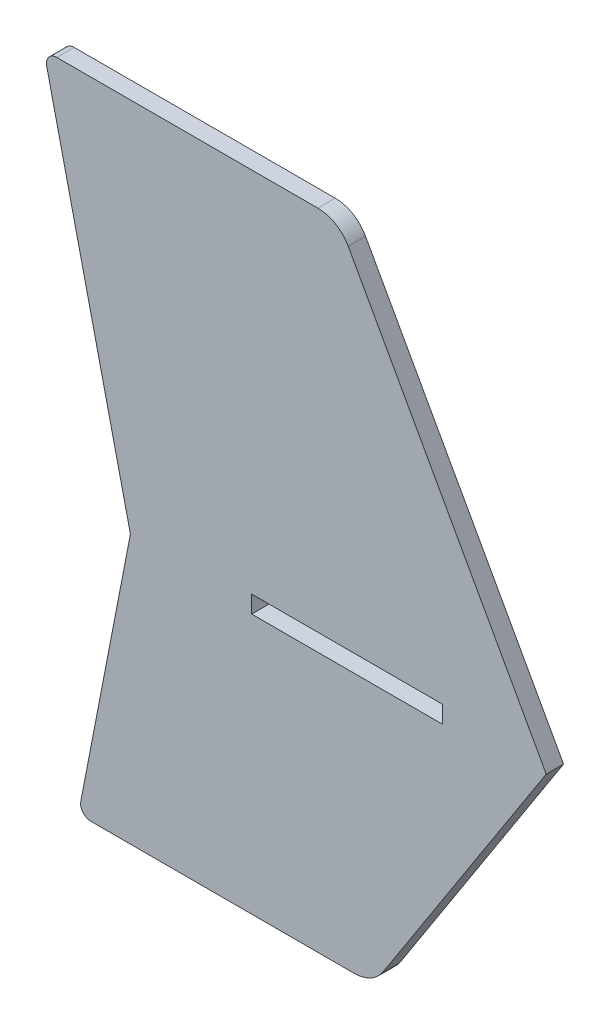
ISO-10303-21;
HEADER;
FILE_DESCRIPTION(('STEP AP214'),'2;1');
FILE_NAME('part.step','',(''),(''),'','','');
FILE_SCHEMA(('AUTOMOTIVE_DESIGN { 1 0 10303 214 1 1 1 1 }'));
ENDSEC;
DATA;
#1=APPLICATION_CONTEXT('core data for automotive mechanical design processes');
#2=APPLICATION_PROTOCOL_DEFINITION('international standard','automotive_design',2000,#1);
#3=PRODUCT_CONTEXT('',#1,'mechanical');
#4=PRODUCT('Part','Part','',(#3));
#5=PRODUCT_RELATED_PRODUCT_CATEGORY('part','',(#4));
#6=PRODUCT_DEFINITION_FORMATION('','',#4);
#7=PRODUCT_DEFINITION_CONTEXT('part definition',#1,'design');
#8=PRODUCT_DEFINITION('design','',#6,#7);
#9=PRODUCT_DEFINITION_SHAPE('','',#8);
#10=(LENGTH_UNIT() NAMED_UNIT(*) SI_UNIT(.MILLI.,.METRE.));
#11=(NAMED_UNIT(*) PLANE_ANGLE_UNIT() SI_UNIT($,.RADIAN.));
#12=(NAMED_UNIT(*) SI_UNIT($,.STERADIAN.) SOLID_ANGLE_UNIT());
#13=UNCERTAINTY_MEASURE_WITH_UNIT(LENGTH_MEASURE(1.E-05),#10,'distance_accuracy_value','');
#14=(GEOMETRIC_REPRESENTATION_CONTEXT(3) GLOBAL_UNCERTAINTY_ASSIGNED_CONTEXT((#13)) GLOBAL_UNIT_ASSIGNED_CONTEXT((#10,
#11,#12)) REPRESENTATION_CONTEXT('',''));
#15=CARTESIAN_POINT('',(0.,0.,0.));
#16=DIRECTION('',(0.,0.,1.));
#17=DIRECTION('',(1.,0.,0.));
#18=AXIS2_PLACEMENT_3D('',#15,#16,#17);
#19=CARTESIAN_POINT('',(-50.,186.,5.));
#20=DIRECTION('',(0.974466825284074,0.224531526563151,0.));
#21=DIRECTION('',(-0.224531526563151,0.974466825284074,0.));
#22=AXIS2_PLACEMENT_3D('',#19,#20,#21);
#23=PLANE('',#22);
#24=DIRECTION('',(0.224531526563151,-0.974466825284073,0.));
#25=VECTOR('',#24,1.);
#26=CARTESIAN_POINT('',(-50.,186.,5.));
#27=LINE('',#26,#25);
#28=CARTESIAN_POINT('',(-49.1535496360163,182.32640542031,5.));
#29=VERTEX_POINT('',#28);
#30=CARTESIAN_POINT('',(-25.,77.5,5.));
#31=VERTEX_POINT('',#30);
#32=EDGE_CURVE('E168',#29,#31,#27,.T.);
#33=ORIENTED_EDGE('',*,*,#32,.F.);
#34=DIRECTION('',(0.,0.,-1.));
#35=VECTOR('',#34,1.);
#36=CARTESIAN_POINT('',(-49.1535496360163,182.32640542031,0.));
#37=LINE('',#36,#35);
#38=CARTESIAN_POINT('',(-49.1535496360163,182.32640542031,0.));
#39=VERTEX_POINT('',#38);
#40=EDGE_CURVE('E41',#29,#39,#37,.T.);
#41=ORIENTED_EDGE('',*,*,#40,.T.);
#42=DIRECTION('',(0.224531526563151,-0.974466825284073,0.));
#43=VECTOR('',#42,1.);
#44=CARTESIAN_POINT('',(-50.,186.,0.));
#45=LINE('',#44,#43);
#46=CARTESIAN_POINT('',(-25.,77.5,0.));
#47=VERTEX_POINT('',#46);
#48=EDGE_CURVE('E165',#39,#47,#45,.T.);
#49=ORIENTED_EDGE('',*,*,#48,.T.);
#50=DIRECTION('',(0.,0.,-1.));
#51=VECTOR('',#50,1.);
#52=CARTESIAN_POINT('',(-25.,77.5,5.));
#53=LINE('',#52,#51);
#54=EDGE_CURVE('E199',#31,#47,#53,.T.);
#55=ORIENTED_EDGE('',*,*,#54,.F.);
#56=EDGE_LOOP('',(#33,#41,#49,#55));
#57=FACE_BOUND('',#56,.T.);
#58=ADVANCED_FACE('F33',(#57),#23,.F.);
#59=CARTESIAN_POINT('',(-25.,77.5,5.));
#60=DIRECTION('',(0.981779850590281,-0.190021906565861,0.));
#61=DIRECTION('',(0.190021906565861,0.981779850590281,0.));
#62=AXIS2_PLACEMENT_3D('',#59,#60,#61);
#63=PLANE('',#62);
#64=DIRECTION('',(-0.190021906565861,-0.981779850590281,0.));
#65=VECTOR('',#64,1.);
#66=CARTESIAN_POINT('',(-25.,77.5,0.));
#67=LINE('',#66,#65);
#68=CARTESIAN_POINT('',(-39.309019538123,3.5700657196976,0.));
#69=VERTEX_POINT('',#68);
#70=EDGE_CURVE('E185',#47,#69,#67,.T.);
#71=ORIENTED_EDGE('',*,*,#70,.T.);
#72=DIRECTION('',(0.,0.,-1.));
#73=VECTOR('',#72,1.);
#74=CARTESIAN_POINT('',(-39.309019538123,3.57006571969758,5.));
#75=LINE('',#74,#73);
#76=CARTESIAN_POINT('',(-39.309019538123,3.5700657196976,5.));
#77=VERTEX_POINT('',#76);
#78=EDGE_CURVE('E238',#69,#77,#75,.F.);
#79=ORIENTED_EDGE('',*,*,#78,.T.);
#80=DIRECTION('',(-0.190021906565861,-0.981779850590281,0.));
#81=VECTOR('',#80,1.);
#82=CARTESIAN_POINT('',(-25.,77.5,5.));
#83=LINE('',#82,#81);
#84=EDGE_CURVE('E170',#31,#77,#83,.T.);
#85=ORIENTED_EDGE('',*,*,#84,.F.);
#86=ORIENTED_EDGE('',*,*,#54,.T.);
#87=EDGE_LOOP('',(#71,#79,#85,#86));
#88=FACE_BOUND('',#87,.T.);
#89=ADVANCED_FACE('F254',(#88),#63,.F.);
#90=CARTESIAN_POINT('',(45.,0.,5.));
#91=DIRECTION('',(0.,-1.,0.));
#92=DIRECTION('',(1.,0.,0.));
#93=AXIS2_PLACEMENT_3D('',#90,#91,#92);
#94=PLANE('',#93);
#95=DIRECTION('',(1.,0.,0.));
#96=VECTOR('',#95,1.);
#97=CARTESIAN_POINT('',(-40.,0.,5.));
#98=LINE('',#97,#96);
#99=CARTESIAN_POINT('',(-36.3636799863522,0.,5.));
#100=VERTEX_POINT('',#99);
#101=CARTESIAN_POINT('',(39.5510537124537,0.,5.));
#102=VERTEX_POINT('',#101);
#103=EDGE_CURVE('E174',#100,#102,#98,.T.);
#104=ORIENTED_EDGE('',*,*,#103,.F.);
#105=DIRECTION('',(0.,0.,-1.));
#106=VECTOR('',#105,1.);
#107=CARTESIAN_POINT('',(-36.3636799863522,0.,0.));
#108=LINE('',#107,#106);
#109=CARTESIAN_POINT('',(-36.3636799863522,0.,0.));
#110=VERTEX_POINT('',#109);
#111=EDGE_CURVE('E231',#100,#110,#108,.T.);
#112=ORIENTED_EDGE('',*,*,#111,.T.);
#113=DIRECTION('',(-1.,0.,0.));
#114=VECTOR('',#113,1.);
#115=CARTESIAN_POINT('',(45.,0.,0.));
#116=LINE('',#115,#114);
#117=CARTESIAN_POINT('',(39.5510537124537,0.,0.));
#118=VERTEX_POINT('',#117);
#119=EDGE_CURVE('E188',#118,#110,#116,.T.);
#120=ORIENTED_EDGE('',*,*,#119,.F.);
#121=DIRECTION('',(0.,0.,-1.));
#122=VECTOR('',#121,1.);
#123=CARTESIAN_POINT('',(39.5510537124537,0.,5.));
#124=LINE('',#123,#122);
#125=EDGE_CURVE('E218',#118,#102,#124,.F.);
#126=ORIENTED_EDGE('',*,*,#125,.T.);
#127=EDGE_LOOP('',(#104,#112,#120,#126));
#128=FACE_BOUND('',#127,.T.);
#129=ADVANCED_FACE('F262',(#128),#94,.T.);
#130=CARTESIAN_POINT('',(95.,77.5,5.));
#131=DIRECTION('',(0.840296648224244,-0.542126869822093,0.));
#132=DIRECTION('',(0.542126869822093,0.840296648224244,0.));
#133=AXIS2_PLACEMENT_3D('',#130,#131,#132);
#134=PLANE('',#133);
#135=DIRECTION('',(-0.542126869822093,-0.840296648224244,0.));
#136=VECTOR('',#135,1.);
#137=CARTESIAN_POINT('',(95.,77.5,5.));
#138=LINE('',#137,#136);
#139=CARTESIAN_POINT('',(95.,77.5,5.));
#140=VERTEX_POINT('',#139);
#141=CARTESIAN_POINT('',(47.9540201946962,4.57873130177908,5.));
#142=VERTEX_POINT('',#141);
#143=EDGE_CURVE('E176',#140,#142,#138,.T.);
#144=ORIENTED_EDGE('',*,*,#143,.T.);
#145=DIRECTION('',(0.,0.,-1.));
#146=VECTOR('',#145,1.);
#147=CARTESIAN_POINT('',(47.9540201946962,4.57873130177906,5.));
#148=LINE('',#147,#146);
#149=CARTESIAN_POINT('',(47.9540201946962,4.57873130177908,0.));
#150=VERTEX_POINT('',#149);
#151=EDGE_CURVE('E211',#142,#150,#148,.T.);
#152=ORIENTED_EDGE('',*,*,#151,.T.);
#153=DIRECTION('',(-0.542126869822093,-0.840296648224244,0.));
#154=VECTOR('',#153,1.);
#155=CARTESIAN_POINT('',(95.,77.5,0.));
#156=LINE('',#155,#154);
#157=CARTESIAN_POINT('',(95.,77.5,0.));
#158=VERTEX_POINT('',#157);
#159=EDGE_CURVE('E191',#158,#150,#156,.T.);
#160=ORIENTED_EDGE('',*,*,#159,.F.);
#161=DIRECTION('',(0.,0.,-1.));
#162=VECTOR('',#161,1.);
#163=CARTESIAN_POINT('',(95.,77.5,5.));
#164=LINE('',#163,#162);
#165=EDGE_CURVE('E183',#140,#158,#164,.T.);
#166=ORIENTED_EDGE('',*,*,#165,.F.);
#167=EDGE_LOOP('',(#144,#152,#160,#166));
#168=FACE_BOUND('',#167,.T.);
#169=ADVANCED_FACE('F270',(#168),#134,.T.);
#170=CARTESIAN_POINT('',(35.,186.,5.));
#171=DIRECTION('',(0.875106719898271,0.483929983353883,0.));
#172=DIRECTION('',(-0.483929983353883,0.875106719898271,0.));
#173=AXIS2_PLACEMENT_3D('',#170,#171,#172);
#174=PLANE('',#173);
#175=DIRECTION('',(0.483929983353883,-0.875106719898271,0.));
#176=VECTOR('',#175,1.);
#177=CARTESIAN_POINT('',(35.,186.,0.));
#178=LINE('',#177,#176);
#179=CARTESIAN_POINT('',(37.8538434100246,180.839299833539,0.));
#180=VERTEX_POINT('',#179);
#181=EDGE_CURVE('E194',#180,#158,#178,.T.);
#182=ORIENTED_EDGE('',*,*,#181,.F.);
#183=DIRECTION('',(0.,0.,-1.));
#184=VECTOR('',#183,1.);
#185=CARTESIAN_POINT('',(37.8538434100246,180.839299833539,5.));
#186=LINE('',#185,#184);
#187=CARTESIAN_POINT('',(37.8538434100246,180.839299833539,5.));
#188=VERTEX_POINT('',#187);
#189=EDGE_CURVE('E229',#180,#188,#186,.F.);
#190=ORIENTED_EDGE('',*,*,#189,.T.);
#191=DIRECTION('',(0.483929983353883,-0.875106719898271,0.));
#192=VECTOR('',#191,1.);
#193=CARTESIAN_POINT('',(35.,186.,5.));
#194=LINE('',#193,#192);
#195=EDGE_CURVE('E179',#188,#140,#194,.T.);
#196=ORIENTED_EDGE('',*,*,#195,.T.);
#197=ORIENTED_EDGE('',*,*,#165,.T.);
#198=EDGE_LOOP('',(#182,#190,#196,#197));
#199=FACE_BOUND('',#198,.T.);
#200=ADVANCED_FACE('F339',(#199),#174,.T.);
#201=CARTESIAN_POINT('',(-50.,186.,5.));
#202=DIRECTION('',(0.,1.,0.));
#203=DIRECTION('',(-1.,0.,0.));
#204=AXIS2_PLACEMENT_3D('',#201,#202,#203);
#205=PLANE('',#204);
#206=DIRECTION('',(1.,0.,0.));
#207=VECTOR('',#206,1.);
#208=CARTESIAN_POINT('',(-50.,186.,0.));
#209=LINE('',#208,#207);
#210=CARTESIAN_POINT('',(-46.230149160164,186.,0.));
#211=VERTEX_POINT('',#210);
#212=CARTESIAN_POINT('',(29.1027762110419,186.,0.));
#213=VERTEX_POINT('',#212);
#214=EDGE_CURVE('E171',#211,#213,#209,.T.);
#215=ORIENTED_EDGE('',*,*,#214,.F.);
#216=DIRECTION('',(0.,0.,-1.));
#217=VECTOR('',#216,1.);
#218=CARTESIAN_POINT('',(-46.230149160164,186.,5.));
#219=LINE('',#218,#217);
#220=CARTESIAN_POINT('',(-46.230149160164,186.,5.));
#221=VERTEX_POINT('',#220);
#222=EDGE_CURVE('E11',#211,#221,#219,.F.);
#223=ORIENTED_EDGE('',*,*,#222,.T.);
#224=DIRECTION('',(1.,0.,0.));
#225=VECTOR('',#224,1.);
#226=CARTESIAN_POINT('',(-50.,186.,5.));
#227=LINE('',#226,#225);
#228=CARTESIAN_POINT('',(29.1027762110419,186.,5.));
#229=VERTEX_POINT('',#228);
#230=EDGE_CURVE('E181',#221,#229,#227,.T.);
#231=ORIENTED_EDGE('',*,*,#230,.T.);
#232=DIRECTION('',(0.,0.,-1.));
#233=VECTOR('',#232,1.);
#234=CARTESIAN_POINT('',(29.1027762110419,186.,5.));
#235=LINE('',#234,#233);
#236=EDGE_CURVE('E226',#229,#213,#235,.T.);
#237=ORIENTED_EDGE('',*,*,#236,.T.);
#238=EDGE_LOOP('',(#215,#223,#231,#237));
#239=FACE_BOUND('',#238,.T.);
#240=ADVANCED_FACE('F281',(#239),#205,.T.);
#241=CARTESIAN_POINT('',(0.,0.,5.));
#242=DIRECTION('',(0.,0.,1.));
#243=DIRECTION('',(1.,0.,0.));
#244=AXIS2_PLACEMENT_3D('',#241,#242,#243);
#245=PLANE('',#244);
#246=DIRECTION('',(0.,-1.,0.));
#247=VECTOR('',#246,1.);
#248=CARTESIAN_POINT('',(10.,75.,5.));
#249=LINE('',#248,#247);
#250=CARTESIAN_POINT('',(10.,80.,5.));
#251=VERTEX_POINT('',#250);
#252=CARTESIAN_POINT('',(10.,75.,5.));
#253=VERTEX_POINT('',#252);
#254=EDGE_CURVE('E154',#251,#253,#249,.T.);
#255=ORIENTED_EDGE('',*,*,#254,.F.);
#256=DIRECTION('',(-1.,0.,0.));
#257=VECTOR('',#256,1.);
#258=CARTESIAN_POINT('',(10.,80.,5.));
#259=LINE('',#258,#257);
#260=CARTESIAN_POINT('',(65.,80.,5.));
#261=VERTEX_POINT('',#260);
#262=EDGE_CURVE('E158',#261,#251,#259,.T.);
#263=ORIENTED_EDGE('',*,*,#262,.F.);
#264=DIRECTION('',(0.,1.,0.));
#265=VECTOR('',#264,1.);
#266=CARTESIAN_POINT('',(65.,75.,5.));
#267=LINE('',#266,#265);
#268=CARTESIAN_POINT('',(65.,75.,5.));
#269=VERTEX_POINT('',#268);
#270=EDGE_CURVE('E138',#269,#261,#267,.T.);
#271=ORIENTED_EDGE('',*,*,#270,.F.);
#272=DIRECTION('',(1.,0.,0.));
#273=VECTOR('',#272,1.);
#274=CARTESIAN_POINT('',(10.,75.,5.));
#275=LINE('',#274,#273);
#276=EDGE_CURVE('E149',#253,#269,#275,.T.);
#277=ORIENTED_EDGE('',*,*,#276,.F.);
#278=EDGE_LOOP('',(#255,#263,#271,#277));
#279=FACE_BOUND('',#278,.T.);
#280=ORIENTED_EDGE('',*,*,#84,.T.);
#281=CARTESIAN_POINT('',(-36.3636799863522,3.,5.));
#282=DIRECTION('',(0.,0.,1.));
#283=DIRECTION('',(1.,0.,0.));
#284=AXIS2_PLACEMENT_3D('',#281,#282,#283);
#285=CIRCLE('',#284,3.);
#286=EDGE_CURVE('E241',#77,#100,#285,.T.);
#287=ORIENTED_EDGE('',*,*,#286,.T.);
#288=ORIENTED_EDGE('',*,*,#103,.T.);
#289=CARTESIAN_POINT('',(39.5510537124537,9.99999999999999,5.));
#290=DIRECTION('',(0.,0.,1.));
#291=DIRECTION('',(1.,0.,0.));
#292=AXIS2_PLACEMENT_3D('',#289,#290,#291);
#293=CIRCLE('',#292,10.);
#294=EDGE_CURVE('E224',#102,#142,#293,.T.);
#295=ORIENTED_EDGE('',*,*,#294,.T.);
#296=ORIENTED_EDGE('',*,*,#143,.F.);
#297=ORIENTED_EDGE('',*,*,#195,.F.);
#298=CARTESIAN_POINT('',(29.1027762110419,176.,5.));
#299=DIRECTION('',(0.,0.,1.));
#300=DIRECTION('',(1.,0.,0.));
#301=AXIS2_PLACEMENT_3D('',#298,#299,#300);
#302=CIRCLE('',#301,10.);
#303=EDGE_CURVE('E221',#188,#229,#302,.T.);
#304=ORIENTED_EDGE('',*,*,#303,.T.);
#305=ORIENTED_EDGE('',*,*,#230,.F.);
#306=CARTESIAN_POINT('',(-46.230149160164,183.,5.));
#307=DIRECTION('',(0.,0.,1.));
#308=DIRECTION('',(1.,0.,0.));
#309=AXIS2_PLACEMENT_3D('',#306,#307,#308);
#310=CIRCLE('',#309,3.);
#311=EDGE_CURVE('E48',#221,#29,#310,.T.);
#312=ORIENTED_EDGE('',*,*,#311,.T.);
#313=ORIENTED_EDGE('',*,*,#32,.T.);
#314=EDGE_LOOP('',(#280,#287,#288,#295,#296,#297,#304,#305,#312,#313));
#315=FACE_BOUND('',#314,.T.);
#316=ADVANCED_FACE('F156',(#279,#315),#245,.T.);
#317=CARTESIAN_POINT('',(0.,0.,0.));
#318=DIRECTION('',(0.,0.,1.));
#319=DIRECTION('',(1.,0.,0.));
#320=AXIS2_PLACEMENT_3D('',#317,#318,#319);
#321=PLANE('',#320);
#322=DIRECTION('',(-1.,0.,0.));
#323=VECTOR('',#322,1.);
#324=CARTESIAN_POINT('',(0.,80.,0.));
#325=LINE('',#324,#323);
#326=CARTESIAN_POINT('',(65.,80.,0.));
#327=VERTEX_POINT('',#326);
#328=CARTESIAN_POINT('',(10.,80.,0.));
#329=VERTEX_POINT('',#328);
#330=EDGE_CURVE('E205',#327,#329,#325,.T.);
#331=ORIENTED_EDGE('',*,*,#330,.T.);
#332=DIRECTION('',(0.,-1.,0.));
#333=VECTOR('',#332,1.);
#334=CARTESIAN_POINT('',(10.,0.,0.));
#335=LINE('',#334,#333);
#336=CARTESIAN_POINT('',(10.,75.,0.));
#337=VERTEX_POINT('',#336);
#338=EDGE_CURVE('E208',#329,#337,#335,.T.);
#339=ORIENTED_EDGE('',*,*,#338,.T.);
#340=DIRECTION('',(1.,0.,0.));
#341=VECTOR('',#340,1.);
#342=CARTESIAN_POINT('',(0.,75.,0.));
#343=LINE('',#342,#341);
#344=CARTESIAN_POINT('',(65.,75.,0.));
#345=VERTEX_POINT('',#344);
#346=EDGE_CURVE('E202',#337,#345,#343,.T.);
#347=ORIENTED_EDGE('',*,*,#346,.T.);
#348=DIRECTION('',(0.,1.,0.));
#349=VECTOR('',#348,1.);
#350=CARTESIAN_POINT('',(65.,0.,0.));
#351=LINE('',#350,#349);
#352=EDGE_CURVE('E141',#345,#327,#351,.T.);
#353=ORIENTED_EDGE('',*,*,#352,.T.);
#354=EDGE_LOOP('',(#331,#339,#347,#353));
#355=FACE_BOUND('',#354,.T.);
#356=ORIENTED_EDGE('',*,*,#119,.T.);
#357=CARTESIAN_POINT('',(-36.3636799863522,3.,0.));
#358=DIRECTION('',(0.,0.,1.));
#359=DIRECTION('',(1.,0.,0.));
#360=AXIS2_PLACEMENT_3D('',#357,#358,#359);
#361=CIRCLE('',#360,3.);
#362=EDGE_CURVE('E236',#110,#69,#361,.F.);
#363=ORIENTED_EDGE('',*,*,#362,.T.);
#364=ORIENTED_EDGE('',*,*,#70,.F.);
#365=ORIENTED_EDGE('',*,*,#48,.F.);
#366=CARTESIAN_POINT('',(-46.230149160164,183.,0.));
#367=DIRECTION('',(0.,0.,1.));
#368=DIRECTION('',(1.,0.,0.));
#369=AXIS2_PLACEMENT_3D('',#366,#367,#368);
#370=CIRCLE('',#369,3.);
#371=EDGE_CURVE('E234',#39,#211,#370,.F.);
#372=ORIENTED_EDGE('',*,*,#371,.T.);
#373=ORIENTED_EDGE('',*,*,#214,.T.);
#374=CARTESIAN_POINT('',(29.1027762110419,176.,0.));
#375=DIRECTION('',(0.,0.,1.));
#376=DIRECTION('',(1.,0.,0.));
#377=AXIS2_PLACEMENT_3D('',#374,#375,#376);
#378=CIRCLE('',#377,10.);
#379=EDGE_CURVE('E214',#213,#180,#378,.F.);
#380=ORIENTED_EDGE('',*,*,#379,.T.);
#381=ORIENTED_EDGE('',*,*,#181,.T.);
#382=ORIENTED_EDGE('',*,*,#159,.T.);
#383=CARTESIAN_POINT('',(39.5510537124537,9.99999999999999,0.));
#384=DIRECTION('',(0.,0.,1.));
#385=DIRECTION('',(1.,0.,0.));
#386=AXIS2_PLACEMENT_3D('',#383,#384,#385);
#387=CIRCLE('',#386,10.);
#388=EDGE_CURVE('E216',#150,#118,#387,.F.);
#389=ORIENTED_EDGE('',*,*,#388,.T.);
#390=EDGE_LOOP('',(#356,#363,#364,#365,#372,#373,#380,#381,#382,#389));
#391=FACE_BOUND('',#390,.T.);
#392=ADVANCED_FACE('F250',(#355,#391),#321,.F.);
#393=CARTESIAN_POINT('',(10.,75.,-10.));
#394=DIRECTION('',(-1.,0.,0.));
#395=DIRECTION('',(0.,0.,1.));
#396=AXIS2_PLACEMENT_3D('',#393,#394,#395);
#397=PLANE('',#396);
#398=DIRECTION('',(0.,0.,1.));
#399=VECTOR('',#398,1.);
#400=CARTESIAN_POINT('',(10.,80.,-10.));
#401=LINE('',#400,#399);
#402=EDGE_CURVE('E163',#329,#251,#401,.T.);
#403=ORIENTED_EDGE('',*,*,#402,.T.);
#404=ORIENTED_EDGE('',*,*,#254,.T.);
#405=DIRECTION('',(0.,0.,1.));
#406=VECTOR('',#405,1.);
#407=CARTESIAN_POINT('',(10.,75.,-10.));
#408=LINE('',#407,#406);
#409=EDGE_CURVE('E145',#337,#253,#408,.T.);
#410=ORIENTED_EDGE('',*,*,#409,.F.);
#411=ORIENTED_EDGE('',*,*,#338,.F.);
#412=EDGE_LOOP('',(#403,#404,#410,#411));
#413=FACE_BOUND('',#412,.T.);
#414=ADVANCED_FACE('F319',(#413),#397,.F.);
#415=CARTESIAN_POINT('',(10.,80.,-10.));
#416=DIRECTION('',(0.,1.,0.));
#417=DIRECTION('',(0.,0.,1.));
#418=AXIS2_PLACEMENT_3D('',#415,#416,#417);
#419=PLANE('',#418);
#420=DIRECTION('',(0.,0.,1.));
#421=VECTOR('',#420,1.);
#422=CARTESIAN_POINT('',(65.,80.,-10.));
#423=LINE('',#422,#421);
#424=EDGE_CURVE('E144',#327,#261,#423,.T.);
#425=ORIENTED_EDGE('',*,*,#424,.T.);
#426=ORIENTED_EDGE('',*,*,#262,.T.);
#427=ORIENTED_EDGE('',*,*,#402,.F.);
#428=ORIENTED_EDGE('',*,*,#330,.F.);
#429=EDGE_LOOP('',(#425,#426,#427,#428));
#430=FACE_BOUND('',#429,.T.);
#431=ADVANCED_FACE('F395',(#430),#419,.F.);
#432=CARTESIAN_POINT('',(65.,75.,-10.));
#433=DIRECTION('',(1.,0.,0.));
#434=DIRECTION('',(0.,0.,-1.));
#435=AXIS2_PLACEMENT_3D('',#432,#433,#434);
#436=PLANE('',#435);
#437=DIRECTION('',(0.,0.,1.));
#438=VECTOR('',#437,1.);
#439=CARTESIAN_POINT('',(65.,75.,-10.));
#440=LINE('',#439,#438);
#441=EDGE_CURVE('E133',#345,#269,#440,.T.);
#442=ORIENTED_EDGE('',*,*,#441,.T.);
#443=ORIENTED_EDGE('',*,*,#270,.T.);
#444=ORIENTED_EDGE('',*,*,#424,.F.);
#445=ORIENTED_EDGE('',*,*,#352,.F.);
#446=EDGE_LOOP('',(#442,#443,#444,#445));
#447=FACE_BOUND('',#446,.T.);
#448=ADVANCED_FACE('F135',(#447),#436,.F.);
#449=CARTESIAN_POINT('',(10.,75.,-10.));
#450=DIRECTION('',(0.,-1.,0.));
#451=DIRECTION('',(0.,0.,-1.));
#452=AXIS2_PLACEMENT_3D('',#449,#450,#451);
#453=PLANE('',#452);
#454=ORIENTED_EDGE('',*,*,#409,.T.);
#455=ORIENTED_EDGE('',*,*,#276,.T.);
#456=ORIENTED_EDGE('',*,*,#441,.F.);
#457=ORIENTED_EDGE('',*,*,#346,.F.);
#458=EDGE_LOOP('',(#454,#455,#456,#457));
#459=FACE_BOUND('',#458,.T.);
#460=ADVANCED_FACE('F150',(#459),#453,.F.);
#461=CARTESIAN_POINT('',(39.5510537124537,9.99999999999999,5.));
#462=DIRECTION('',(0.,0.,-1.));
#463=DIRECTION('',(-1.,0.,0.));
#464=AXIS2_PLACEMENT_3D('',#461,#462,#463);
#465=CYLINDRICAL_SURFACE('',#464,10.);
#466=ORIENTED_EDGE('',*,*,#294,.F.);
#467=ORIENTED_EDGE('',*,*,#125,.F.);
#468=ORIENTED_EDGE('',*,*,#388,.F.);
#469=ORIENTED_EDGE('',*,*,#151,.F.);
#470=EDGE_LOOP('',(#466,#467,#468,#469));
#471=FACE_BOUND('',#470,.T.);
#472=ADVANCED_FACE('F268',(#471),#465,.T.);
#473=CARTESIAN_POINT('',(29.1027762110419,176.,5.));
#474=DIRECTION('',(0.,0.,-1.));
#475=DIRECTION('',(-1.,0.,0.));
#476=AXIS2_PLACEMENT_3D('',#473,#474,#475);
#477=CYLINDRICAL_SURFACE('',#476,10.);
#478=ORIENTED_EDGE('',*,*,#303,.F.);
#479=ORIENTED_EDGE('',*,*,#189,.F.);
#480=ORIENTED_EDGE('',*,*,#379,.F.);
#481=ORIENTED_EDGE('',*,*,#236,.F.);
#482=EDGE_LOOP('',(#478,#479,#480,#481));
#483=FACE_BOUND('',#482,.T.);
#484=ADVANCED_FACE('F279',(#483),#477,.T.);
#485=CARTESIAN_POINT('',(-36.3636799863522,3.,5.));
#486=DIRECTION('',(0.,0.,1.));
#487=DIRECTION('',(1.,0.,0.));
#488=AXIS2_PLACEMENT_3D('',#485,#486,#487);
#489=CYLINDRICAL_SURFACE('',#488,3.);
#490=ORIENTED_EDGE('',*,*,#286,.F.);
#491=ORIENTED_EDGE('',*,*,#78,.F.);
#492=ORIENTED_EDGE('',*,*,#362,.F.);
#493=ORIENTED_EDGE('',*,*,#111,.F.);
#494=EDGE_LOOP('',(#490,#491,#492,#493));
#495=FACE_BOUND('',#494,.T.);
#496=ADVANCED_FACE('F259',(#495),#489,.T.);
#497=CARTESIAN_POINT('',(-46.230149160164,183.,5.));
#498=DIRECTION('',(0.,0.,1.));
#499=DIRECTION('',(1.,0.,0.));
#500=AXIS2_PLACEMENT_3D('',#497,#498,#499);
#501=CYLINDRICAL_SURFACE('',#500,3.);
#502=ORIENTED_EDGE('',*,*,#311,.F.);
#503=ORIENTED_EDGE('',*,*,#222,.F.);
#504=ORIENTED_EDGE('',*,*,#371,.F.);
#505=ORIENTED_EDGE('',*,*,#40,.F.);
#506=EDGE_LOOP('',(#502,#503,#504,#505));
#507=FACE_BOUND('',#506,.T.);
#508=ADVANCED_FACE('F35',(#507),#501,.T.);
#509=CLOSED_SHELL('',(#58,#89,#129,#169,#200,#240,#316,#392,#414,#431,#448,#460,#472,#484,#496,#508));
#510=MANIFOLD_SOLID_BREP('B2',#509);
#511=ADVANCED_BREP_SHAPE_REPRESENTATION('',(#18,#510),#14);
#512=SHAPE_DEFINITION_REPRESENTATION(#9,#511);
ENDSEC;
END-ISO-10303-21;
